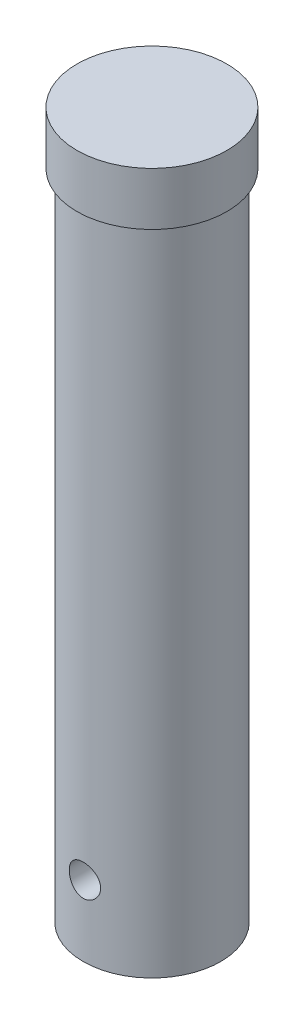
ISO-10303-21;
HEADER;
FILE_DESCRIPTION(('STEP AP214'),'2;1');
FILE_NAME('part.step','',(''),(''),'','','');
FILE_SCHEMA(('AUTOMOTIVE_DESIGN { 1 0 10303 214 1 1 1 1 }'));
ENDSEC;
DATA;
#1=APPLICATION_CONTEXT('core data for automotive mechanical design processes');
#2=APPLICATION_PROTOCOL_DEFINITION('international standard','automotive_design',2000,#1);
#3=PRODUCT_CONTEXT('',#1,'mechanical');
#4=PRODUCT('Part','Part','',(#3));
#5=PRODUCT_RELATED_PRODUCT_CATEGORY('part','',(#4));
#6=PRODUCT_DEFINITION_FORMATION('','',#4);
#7=PRODUCT_DEFINITION_CONTEXT('part definition',#1,'design');
#8=PRODUCT_DEFINITION('design','',#6,#7);
#9=PRODUCT_DEFINITION_SHAPE('','',#8);
#10=(LENGTH_UNIT() NAMED_UNIT(*) SI_UNIT(.MILLI.,.METRE.));
#11=(NAMED_UNIT(*) PLANE_ANGLE_UNIT() SI_UNIT($,.RADIAN.));
#12=(NAMED_UNIT(*) SI_UNIT($,.STERADIAN.) SOLID_ANGLE_UNIT());
#13=UNCERTAINTY_MEASURE_WITH_UNIT(LENGTH_MEASURE(1.E-05),#10,'distance_accuracy_value','');
#14=(GEOMETRIC_REPRESENTATION_CONTEXT(3) GLOBAL_UNCERTAINTY_ASSIGNED_CONTEXT((#13)) GLOBAL_UNIT_ASSIGNED_CONTEXT((#10,
#11,#12)) REPRESENTATION_CONTEXT('',''));
#15=CARTESIAN_POINT('',(0.,0.,0.));
#16=DIRECTION('',(0.,0.,1.));
#17=DIRECTION('',(1.,0.,0.));
#18=AXIS2_PLACEMENT_3D('',#15,#16,#17);
#19=CARTESIAN_POINT('',(0.,50.8,0.));
#20=DIRECTION('',(0.,-1.,0.));
#21=DIRECTION('',(0.,0.,-1.));
#22=AXIS2_PLACEMENT_3D('',#19,#20,#21);
#23=CYLINDRICAL_SURFACE('',#22,4.953);
#24=CARTESIAN_POINT('',(0.,6.2103,-4.953));
#25=CARTESIAN_POINT('',(-0.0626199285761378,6.21029796170064,-4.95299885982234));
#26=CARTESIAN_POINT('',(-0.125263915628987,6.2050786204916,-4.9518004601454));
#27=CARTESIAN_POINT('',(-0.248767848730751,6.18436359790857,-4.9471356569503));
#28=CARTESIAN_POINT('',(-0.309626567875278,6.16886101462116,-4.94366773019039));
#29=CARTESIAN_POINT('',(-0.427757638500117,6.12809403815568,-4.93484939195466));
#30=CARTESIAN_POINT('',(-0.485033822018721,6.10284029016601,-4.92950103388275));
#31=CARTESIAN_POINT('',(-0.594534999275647,6.04332272431043,-4.91749684162111));
#32=CARTESIAN_POINT('',(-0.646760034456201,6.00905898037578,-4.91084101815985));
#33=CARTESIAN_POINT('',(-0.745585278880662,5.93186432540785,-4.89681982569743));
#34=CARTESIAN_POINT('',(-0.792085167134784,5.88880668723982,-4.88944501694452));
#35=CARTESIAN_POINT('',(-0.877269669589451,5.79551834017492,-4.8748824269411));
#36=CARTESIAN_POINT('',(-0.91595353652863,5.74528694620422,-4.8676946636305));
#37=CARTESIAN_POINT('',(-0.984858948125117,5.63832443981465,-4.85422634930692));
#38=CARTESIAN_POINT('',(-1.01497212371892,5.58152186026023,-4.84795786373195));
#39=CARTESIAN_POINT('',(-1.06518571643235,5.4634954957409,-4.83717400761392));
#40=CARTESIAN_POINT('',(-1.08528744546674,5.40227229126573,-4.83265840738729));
#41=CARTESIAN_POINT('',(-1.11457286334543,5.27823530749103,-4.82598800971558));
#42=CARTESIAN_POINT('',(-1.12393499591184,5.21546577700867,-4.82379467555481));
#43=CARTESIAN_POINT('',(-1.13203060851418,5.08921162944782,-4.82190152579054));
#44=CARTESIAN_POINT('',(-1.13076551542939,5.02572710951142,-4.82220137543619));
#45=CARTESIAN_POINT('',(-1.11778583094973,4.90118332167816,-4.82522589604305));
#46=CARTESIAN_POINT('',(-1.1062800497989,4.84010093536548,-4.82790210978596));
#47=CARTESIAN_POINT('',(-1.07347707412558,4.72075697732271,-4.83530102830123));
#48=CARTESIAN_POINT('',(-1.05217928688351,4.6624955765856,-4.84002385695619));
#49=CARTESIAN_POINT('',(-1.00020918047969,4.54986829637329,-4.85103065569048));
#50=CARTESIAN_POINT('',(-0.969457888383556,4.49554018778821,-4.85732769031652));
#51=CARTESIAN_POINT('',(-0.89950912462752,4.39273866957521,-4.87076556092439));
#52=CARTESIAN_POINT('',(-0.860310405718226,4.34426612616341,-4.87790652144019));
#53=CARTESIAN_POINT('',(-0.773481017875347,4.25335105784433,-4.89243443641317));
#54=CARTESIAN_POINT('',(-0.725673166443643,4.21107786467138,-4.89982321881299));
#55=CARTESIAN_POINT('',(-0.623561481538659,4.1351199893696,-4.91386119966189));
#56=CARTESIAN_POINT('',(-0.569257509318103,4.10143549073038,-4.92051038230839));
#57=CARTESIAN_POINT('',(-0.455478312132164,4.04356354727669,-4.93234466054798));
#58=CARTESIAN_POINT('',(-0.395990615360193,4.01939982505162,-4.93752609008462));
#59=CARTESIAN_POINT('',(-0.273654210149566,3.98145956624479,-4.94581402396044));
#60=CARTESIAN_POINT('',(-0.210806036490164,3.96768138216777,-4.94892085739133));
#61=CARTESIAN_POINT('',(-0.0849837932500926,3.95115315622231,-4.95266215980127));
#62=CARTESIAN_POINT('',(-0.0220415789470728,3.94817202084962,-4.95334842858299));
#63=CARTESIAN_POINT('',(0.103441635756751,3.95269398780922,-4.95231712355682));
#64=CARTESIAN_POINT('',(0.16598266557124,3.96019631249098,-4.95059972804986));
#65=CARTESIAN_POINT('',(0.288111679367025,3.98528088715108,-4.94498690418659));
#66=CARTESIAN_POINT('',(0.34772617627607,4.00274051482367,-4.94111798560487));
#67=CARTESIAN_POINT('',(0.46317957867657,4.04710683269876,-4.9316358276821));
#68=CARTESIAN_POINT('',(0.519018143060428,4.07401437504444,-4.92602243100521));
#69=CARTESIAN_POINT('',(0.626279813765783,4.13698438088046,-4.91354714097944));
#70=CARTESIAN_POINT('',(0.677622174093214,4.17318077669369,-4.90666743888929));
#71=CARTESIAN_POINT('',(0.773586835466045,4.25352618089393,-4.89245642054869));
#72=CARTESIAN_POINT('',(0.818208179252645,4.29767632015136,-4.8851250401759));
#73=CARTESIAN_POINT('',(0.900389247090222,4.39374041390109,-4.87065579673175));
#74=CARTESIAN_POINT('',(0.93778828614353,4.44579306973901,-4.86352482498146));
#75=CARTESIAN_POINT('',(1.00331581556705,4.55557531219405,-4.85043167424552));
#76=CARTESIAN_POINT('',(1.03144471645571,4.61330464727829,-4.84446944350815));
#77=CARTESIAN_POINT('',(1.07743596432888,4.7324872812262,-4.83444879403588));
#78=CARTESIAN_POINT('',(1.09535763716511,4.79391671777432,-4.83037939975124));
#79=CARTESIAN_POINT('',(1.12059536621454,4.9190210411772,-4.82458762768936));
#80=CARTESIAN_POINT('',(1.12791329326675,4.98269552990199,-4.8228648358998));
#81=CARTESIAN_POINT('',(1.13165076857654,5.10885826245455,-4.82198904028732));
#82=CARTESIAN_POINT('',(1.12832562928786,5.17133865780576,-4.82277583339923));
#83=CARTESIAN_POINT('',(1.11144605960396,5.29482329548913,-4.82669351954363));
#84=CARTESIAN_POINT('',(1.09789177258402,5.35582755849892,-4.82982437972087));
#85=CARTESIAN_POINT('',(1.0610668667875,5.47440375345126,-4.83804682485853));
#86=CARTESIAN_POINT('',(1.03783652908223,5.53198879696175,-4.84313027450471));
#87=CARTESIAN_POINT('',(0.982352451474302,5.6424809379715,-4.8546876494469));
#88=CARTESIAN_POINT('',(0.950097677265903,5.69538749834671,-4.86116173410614));
#89=CARTESIAN_POINT('',(0.876647018520754,5.79627236988876,-4.8749483877141));
#90=CARTESIAN_POINT('',(0.83527054088432,5.84411713477704,-4.88227623304003));
#91=CARTESIAN_POINT('',(0.745113010308626,5.93226777957493,-4.8968456001938));
#92=CARTESIAN_POINT('',(0.696330238054623,5.97257190412012,-4.90408710155545));
#93=CARTESIAN_POINT('',(0.591897791767745,6.04505608162774,-4.91779179304421));
#94=CARTESIAN_POINT('',(0.53615936041198,6.07711080828872,-4.92424227578294));
#95=CARTESIAN_POINT('',(0.419947874369055,6.1313450307413,-4.9355089876801));
#96=CARTESIAN_POINT('',(0.359478672504198,6.1535324661758,-4.94032653002682));
#97=CARTESIAN_POINT('',(0.249161833379965,6.18363661903301,-4.94696701823175));
#98=CARTESIAN_POINT('',(0.199892110306613,6.19361560135405,-4.94921494205356));
#99=CARTESIAN_POINT('',(0.100420049770205,6.20694793636163,-4.95223185155115));
#100=CARTESIAN_POINT('',(0.0502177610850681,6.21030163460471,-4.95300091436018));
#101=CARTESIAN_POINT('',(0.,6.2103,-4.953));
#102=B_SPLINE_CURVE_WITH_KNOTS('',3,(#24,#25,#26,#27,#28,#29,#30,#31,#32,#33,#34,#35,#36,#37,
#38,#39,#40,#41,#42,#43,#44,#45,#46,#47,#48,#49,#50,#51,#52,#53,#54,#55,#56,#57,#58,#59,#60,#61,
#62,#63,#64,#65,#66,#67,#68,#69,#70,#71,#72,#73,#74,#75,#76,#77,#78,#79,#80,#81,#82,#83,#84,#85,
#86,#87,#88,#89,#90,#91,#92,#93,#94,#95,#96,#97,#98,#99,#100,#101),.UNSPECIFIED.,.T.,.F.,(4,2,2,
2,2,2,2,2,2,2,2,2,2,2,2,2,2,2,2,2,2,2,2,2,2,2,2,2,2,2,2,2,2,2,2,2,2,2,4),(0.,0.187675908758004,
0.375477909588762,0.563075467036626,0.750671485206516,0.941190489509334,1.13172770003112,
1.32457672015871,1.51740046241216,1.70697169608312,1.89651747711464,2.08228472181698,
2.26806321267075,2.45543789605261,2.64284026399212,2.83466591425551,3.0264956623553,
3.21880040827998,3.41107464178753,3.59920839376264,3.7873281909417,3.97317986395116,
4.15904830393398,4.34776411891302,4.53650678688366,4.72905850027917,4.9216016855757,
5.11301405299601,5.30439264505538,5.49121504425226,5.67803482493057,5.86408453347513,
6.05015557422851,6.24030781236688,6.43050426058246,6.62343917317397,6.81621855998237,
6.96673223454017,7.11723805851238),.UNSPECIFIED.);
#103=CARTESIAN_POINT('',(0.,6.2103,-4.953));
#104=VERTEX_POINT('',#103);
#105=EDGE_CURVE('E45',#104,#104,#102,.T.);
#106=ORIENTED_EDGE('',*,*,#105,.T.);
#107=EDGE_LOOP('',(#106));
#108=FACE_BOUND('',#107,.T.);
#109=CARTESIAN_POINT('',(1.1303,5.08,4.82230555958454));
#110=CARTESIAN_POINT('',(1.13029794533734,5.01740400765558,4.82230681935707));
#111=CARTESIAN_POINT('',(1.1250824576697,4.95478391797633,4.82353763835972));
#112=CARTESIAN_POINT('',(1.10438412687968,4.83132958248992,4.82831787141745));
#113=CARTESIAN_POINT('',(1.08889428394032,4.77049658373733,4.83186886616074));
#114=CARTESIAN_POINT('',(1.04816454552683,4.65242002528655,4.84086681548338));
#115=CARTESIAN_POINT('',(1.02293589142768,4.59517241524901,4.846311583392));
#116=CARTESIAN_POINT('',(0.963477503632184,4.48571953458871,4.85848093497291));
#117=CARTESIAN_POINT('',(0.929247787958489,4.43351425387006,4.86520551608265));
#118=CARTESIAN_POINT('',(0.8520882462994,4.33466846706929,4.87931490365225));
#119=CARTESIAN_POINT('',(0.809024039707081,4.28813413499004,4.88670878162016));
#120=CARTESIAN_POINT('',(0.715707870789584,4.20288265323667,4.90124445701719));
#121=CARTESIAN_POINT('',(0.665455319044242,4.16416614522632,4.90838623371491));
#122=CARTESIAN_POINT('',(0.558472533323851,4.09522514191633,4.9217122849259));
#123=CARTESIAN_POINT('',(0.501674462679876,4.06510340602211,4.92788460593556));
#124=CARTESIAN_POINT('',(0.383657809061746,4.01487276504197,4.93847352514551));
#125=CARTESIAN_POINT('',(0.322439767988981,3.99476263488254,4.94289033814579));
#126=CARTESIAN_POINT('',(0.198425819925628,3.96546178691146,4.94940647409186));
#127=CARTESIAN_POINT('',(0.135674451612387,3.95609118674966,4.95154393149663));
#128=CARTESIAN_POINT('',(0.00945640153920111,3.94797233459766,4.95339286971582));
#129=CARTESIAN_POINT('',(-0.0540101904738555,3.94922276437208,4.95310465159442));
#130=CARTESIAN_POINT('',(-0.178614878217033,3.96217783395304,4.95016363859237));
#131=CARTESIAN_POINT('',(-0.239774329421876,3.97368850754078,4.94755471764636));
#132=CARTESIAN_POINT('',(-0.359269824195748,4.00652745222047,4.94031573572673));
#133=CARTESIAN_POINT('',(-0.417605732798204,4.02785619210912,4.9356855782429));
#134=CARTESIAN_POINT('',(-0.530328666445901,4.07989309771645,4.92485480358431));
#135=CARTESIAN_POINT('',(-0.584681154131916,4.11067347312808,4.91864216092298));
#136=CARTESIAN_POINT('',(-0.687519395181748,4.18068581162318,4.90532555911359));
#137=CARTESIAN_POINT('',(-0.736004282187348,4.21991902040565,4.89822146865684));
#138=CARTESIAN_POINT('',(-0.826885724606379,4.30677478086676,4.88371147151797));
#139=CARTESIAN_POINT('',(-0.869119722730676,4.3545670501932,4.87630237273693));
#140=CARTESIAN_POINT('',(-0.945005685855244,4.45663297874947,4.86216696303822));
#141=CARTESIAN_POINT('',(-0.978657374560047,4.51090684656273,4.85544067410684));
#142=CARTESIAN_POINT('',(-1.03650471754877,4.62467422309373,4.84342306256569));
#143=CARTESIAN_POINT('',(-1.06066723919778,4.68418514796902,4.8381367872821));
#144=CARTESIAN_POINT('',(-1.09859816720351,4.80657254516951,4.8296659059022));
#145=CARTESIAN_POINT('',(-1.1123683852708,4.86944842882718,4.82648093349385));
#146=CARTESIAN_POINT('',(-1.12886664121584,4.99528911567059,4.82264864179028));
#147=CARTESIAN_POINT('',(-1.13183243218251,5.05822112168803,4.82194669337867));
#148=CARTESIAN_POINT('',(-1.12728343507696,5.18368039466325,4.82301217195449));
#149=CARTESIAN_POINT('',(-1.11976943635109,5.24620769174767,4.82477941296058));
#150=CARTESIAN_POINT('',(-1.09468109872252,5.36823904156243,4.83053233442099));
#151=CARTESIAN_POINT('',(-1.0772398522645,5.42777197017364,4.83448864727994));
#152=CARTESIAN_POINT('',(-1.03293720896622,5.54307026507625,4.84414704038036));
#153=CARTESIAN_POINT('',(-1.00607484585817,5.59883524421157,4.84984929968554));
#154=CARTESIAN_POINT('',(-0.94317633698041,5.70603734374381,4.86247565262038));
#155=CARTESIAN_POINT('',(-0.906994979091743,5.7573870091098,4.86941849846307));
#156=CARTESIAN_POINT('',(-0.826673664527466,5.85337327239827,4.88369531376433));
#157=CARTESIAN_POINT('',(-0.782532627469786,5.89800895750935,4.89102933622274));
#158=CARTESIAN_POINT('',(-0.686464589324353,5.98023466320235,4.90544370034424));
#159=CARTESIAN_POINT('',(-0.634396794567038,6.01766188780059,4.91251578429577));
#160=CARTESIAN_POINT('',(-0.524575427473208,6.08323886922287,4.92545247088723));
#161=CARTESIAN_POINT('',(-0.466822132412568,6.11138907818643,4.93131713236881));
#162=CARTESIAN_POINT('',(-0.347643774415581,6.15739204896375,4.94114362952821));
#163=CARTESIAN_POINT('',(-0.286246163688781,6.17531311701939,4.94511805697853));
#164=CARTESIAN_POINT('',(-0.161210060769601,6.20056036485066,4.95077093435552));
#165=CARTESIAN_POINT('',(-0.097571926511641,6.20788822914496,4.95244974932546));
#166=CARTESIAN_POINT('',(0.0285981706490339,6.2116597402524,4.95331022293915));
#167=CARTESIAN_POINT('',(0.0911226353898429,6.20834559076199,4.9525474513921));
#168=CARTESIAN_POINT('',(0.214698390469133,6.19147267422064,4.94873072368518));
#169=CARTESIAN_POINT('',(0.275749711956738,6.17791412398039,4.94567681601451));
#170=CARTESIAN_POINT('',(0.39443946321055,6.14105759391802,4.93762640177551));
#171=CARTESIAN_POINT('',(0.452089956978315,6.1177967416062,4.93263730558124));
#172=CARTESIAN_POINT('',(0.562700627830038,6.06223108721612,4.92124700826988));
#173=CARTESIAN_POINT('',(0.615660306581101,6.02992532575725,4.91484565737223));
#174=CARTESIAN_POINT('',(0.716558223887819,5.95641192268231,4.90116325573141));
#175=CARTESIAN_POINT('',(0.76437152096784,5.91503563708166,4.89386688314999));
#176=CARTESIAN_POINT('',(0.852458781701526,5.82489225135192,4.87929513201851));
#177=CARTESIAN_POINT('',(0.892730902368631,5.77612334979865,4.87201975902715));
#178=CARTESIAN_POINT('',(0.965172109467478,5.67170802167603,4.85819261305376));
#179=CARTESIAN_POINT('',(0.997212046089,5.61597025420855,4.85165318373552));
#180=CARTESIAN_POINT('',(1.05141878998677,5.499761960663,4.84019636697926));
#181=CARTESIAN_POINT('',(1.07359362134694,5.43929532819915,4.83527766212335));
#182=CARTESIAN_POINT('',(1.10366933061005,5.3290100096604,4.82848860407021));
#183=CARTESIAN_POINT('',(1.11363595178907,5.27977090360508,4.82618592639864));
#184=CARTESIAN_POINT('',(1.12695191869292,5.18035965912465,4.82309394292221));
#185=CARTESIAN_POINT('',(1.13030164736642,5.13018757486475,4.82230454953701));
#186=CARTESIAN_POINT('',(1.1303,5.08,4.82230555958454));
#187=B_SPLINE_CURVE_WITH_KNOTS('',3,(#109,#110,#111,#112,#113,#114,#115,#116,#117,#118,#119,
#120,#121,#122,#123,#124,#125,#126,#127,#128,#129,#130,#131,#132,#133,#134,#135,#136,#137,#138,
#139,#140,#141,#142,#143,#144,#145,#146,#147,#148,#149,#150,#151,#152,#153,#154,#155,#156,#157,
#158,#159,#160,#161,#162,#163,#164,#165,#166,#167,#168,#169,#170,#171,#172,#173,#174,#175,#176,
#177,#178,#179,#180,#181,#182,#183,#184,#185,#186),.UNSPECIFIED.,.T.,.F.,(4,2,2,2,2,2,2,2,2,2,2,
2,2,2,2,2,2,2,2,2,2,2,2,2,2,2,2,2,2,2,2,2,2,2,2,2,2,2,4),(0.,0.187603941607324,
0.375335827391729,0.562851661716722,0.750367120585176,0.940980246391862,1.13160901080363,
1.32442961999191,1.5172266288183,1.70674487982663,1.89623960900933,2.08222624271296,
2.26822175789691,2.45567518958626,2.64315626531618,2.83487887011937,3.02660764638517,
3.21900003952577,3.41135888477217,3.59945836863033,3.7875436854463,3.97316485519852,
4.15880506857831,4.34753429664483,4.53628916058914,4.72890502722228,4.92151150483119,
5.11281631426555,5.30409069928905,5.49104295091468,5.67799124602691,5.86423062121226,
6.05048975803142,6.24056061889133,6.43067787067812,6.62361711328632,6.81639913466968,
6.96682301116763,7.11723818171935),.UNSPECIFIED.);
#188=CARTESIAN_POINT('',(1.1303,5.08,4.82230555958454));
#189=VERTEX_POINT('',#188);
#190=EDGE_CURVE('E10',#189,#189,#187,.T.);
#191=ORIENTED_EDGE('',*,*,#190,.T.);
#192=EDGE_LOOP('',(#191));
#193=FACE_BOUND('',#192,.T.);
#194=CARTESIAN_POINT('',(0.,0.,0.));
#195=DIRECTION('',(0.,1.,0.));
#196=DIRECTION('',(0.,0.,1.));
#197=AXIS2_PLACEMENT_3D('',#194,#195,#196);
#198=CIRCLE('',#197,4.953);
#199=CARTESIAN_POINT('',(0.,0.,4.953));
#200=VERTEX_POINT('',#199);
#201=EDGE_CURVE('E59',#200,#200,#198,.T.);
#202=ORIENTED_EDGE('',*,*,#201,.T.);
#203=EDGE_LOOP('',(#202));
#204=FACE_BOUND('',#203,.T.);
#205=CARTESIAN_POINT('',(0.,46.99,0.));
#206=DIRECTION('',(0.,1.,0.));
#207=DIRECTION('',(0.,0.,1.));
#208=AXIS2_PLACEMENT_3D('',#205,#206,#207);
#209=CIRCLE('',#208,4.953);
#210=CARTESIAN_POINT('',(0.,46.99,4.953));
#211=VERTEX_POINT('',#210);
#212=EDGE_CURVE('E54',#211,#211,#209,.T.);
#213=ORIENTED_EDGE('',*,*,#212,.F.);
#214=EDGE_LOOP('',(#213));
#215=FACE_BOUND('',#214,.T.);
#216=ADVANCED_FACE('F41',(#108,#193,#204,#215),#23,.T.);
#217=CARTESIAN_POINT('',(0.,0.,0.));
#218=DIRECTION('',(0.,1.,0.));
#219=DIRECTION('',(0.,0.,1.));
#220=AXIS2_PLACEMENT_3D('',#217,#218,#219);
#221=PLANE('',#220);
#222=ORIENTED_EDGE('',*,*,#201,.F.);
#223=EDGE_LOOP('',(#222));
#224=FACE_BOUND('',#223,.T.);
#225=ADVANCED_FACE('F79',(#224),#221,.F.);
#226=CARTESIAN_POINT('',(0.,46.99,0.));
#227=DIRECTION('',(0.,1.,0.));
#228=DIRECTION('',(0.,0.,1.));
#229=AXIS2_PLACEMENT_3D('',#226,#227,#228);
#230=CYLINDRICAL_SURFACE('',#229,5.3975);
#231=CARTESIAN_POINT('',(0.,46.99,0.));
#232=DIRECTION('',(0.,1.,0.));
#233=DIRECTION('',(0.,0.,1.));
#234=AXIS2_PLACEMENT_3D('',#231,#232,#233);
#235=CIRCLE('',#234,5.3975);
#236=CARTESIAN_POINT('',(0.,46.99,5.3975));
#237=VERTEX_POINT('',#236);
#238=EDGE_CURVE('E93',#237,#237,#235,.T.);
#239=CARTESIAN_POINT('',(0.,50.8,0.));
#240=DIRECTION('',(0.,1.,0.));
#241=DIRECTION('',(0.,0.,1.));
#242=AXIS2_PLACEMENT_3D('',#239,#240,#241);
#243=CIRCLE('',#242,5.3975);
#244=CARTESIAN_POINT('',(0.,50.8,5.3975));
#245=VERTEX_POINT('',#244);
#246=EDGE_CURVE('E96',#245,#245,#243,.T.);
#247=CARTESIAN_POINT('',(0.,46.99,5.3975));
#248=CARTESIAN_POINT('',(0.,47.0296875,5.3975));
#249=CARTESIAN_POINT('',(0.,47.069375,5.3975));
#250=CARTESIAN_POINT('',(0.,47.14875,5.3975));
#251=CARTESIAN_POINT('',(0.,47.1884375,5.3975));
#252=CARTESIAN_POINT('',(0.,47.2678125,5.3975));
#253=CARTESIAN_POINT('',(0.,47.3075,5.3975));
#254=CARTESIAN_POINT('',(0.,47.386875,5.3975));
#255=CARTESIAN_POINT('',(0.,47.4265625,5.3975));
#256=CARTESIAN_POINT('',(0.,47.5059375,5.3975));
#257=CARTESIAN_POINT('',(0.,47.545625,5.3975));
#258=CARTESIAN_POINT('',(0.,47.625,5.3975));
#259=CARTESIAN_POINT('',(0.,47.6646875,5.3975));
#260=CARTESIAN_POINT('',(0.,47.7440625,5.3975));
#261=CARTESIAN_POINT('',(0.,47.78375,5.3975));
#262=CARTESIAN_POINT('',(0.,47.863125,5.3975));
#263=CARTESIAN_POINT('',(0.,47.9028125,5.3975));
#264=CARTESIAN_POINT('',(0.,47.9821875,5.3975));
#265=CARTESIAN_POINT('',(0.,48.021875,5.3975));
#266=CARTESIAN_POINT('',(0.,48.10125,5.3975));
#267=CARTESIAN_POINT('',(0.,48.1409375,5.3975));
#268=CARTESIAN_POINT('',(0.,48.2203125,5.3975));
#269=CARTESIAN_POINT('',(0.,48.26,5.3975));
#270=CARTESIAN_POINT('',(0.,48.339375,5.3975));
#271=CARTESIAN_POINT('',(0.,48.3790625,5.3975));
#272=CARTESIAN_POINT('',(0.,48.4584375,5.3975));
#273=CARTESIAN_POINT('',(0.,48.498125,5.3975));
#274=CARTESIAN_POINT('',(0.,48.5775,5.3975));
#275=CARTESIAN_POINT('',(0.,48.6171875,5.3975));
#276=CARTESIAN_POINT('',(0.,48.6965625,5.3975));
#277=CARTESIAN_POINT('',(0.,48.73625,5.3975));
#278=CARTESIAN_POINT('',(0.,48.815625,5.3975));
#279=CARTESIAN_POINT('',(0.,48.8553125,5.3975));
#280=CARTESIAN_POINT('',(0.,48.9346875,5.3975));
#281=CARTESIAN_POINT('',(0.,48.974375,5.3975));
#282=CARTESIAN_POINT('',(0.,49.05375,5.3975));
#283=CARTESIAN_POINT('',(0.,49.0934375,5.3975));
#284=CARTESIAN_POINT('',(0.,49.1728125,5.3975));
#285=CARTESIAN_POINT('',(0.,49.2125,5.3975));
#286=CARTESIAN_POINT('',(0.,49.291875,5.3975));
#287=CARTESIAN_POINT('',(0.,49.3315625,5.3975));
#288=CARTESIAN_POINT('',(0.,49.4109375,5.3975));
#289=CARTESIAN_POINT('',(0.,49.450625,5.3975));
#290=CARTESIAN_POINT('',(0.,49.53,5.3975));
#291=CARTESIAN_POINT('',(0.,49.5696875,5.3975));
#292=CARTESIAN_POINT('',(0.,49.6490625,5.3975));
#293=CARTESIAN_POINT('',(0.,49.68875,5.3975));
#294=CARTESIAN_POINT('',(0.,49.768125,5.3975));
#295=CARTESIAN_POINT('',(0.,49.8078125,5.3975));
#296=CARTESIAN_POINT('',(0.,49.8871875,5.3975));
#297=CARTESIAN_POINT('',(0.,49.926875,5.3975));
#298=CARTESIAN_POINT('',(0.,50.00625,5.3975));
#299=CARTESIAN_POINT('',(0.,50.0459375,5.3975));
#300=CARTESIAN_POINT('',(0.,50.1253125,5.3975));
#301=CARTESIAN_POINT('',(0.,50.165,5.3975));
#302=CARTESIAN_POINT('',(0.,50.244375,5.3975));
#303=CARTESIAN_POINT('',(0.,50.2840625,5.3975));
#304=CARTESIAN_POINT('',(0.,50.3634375,5.3975));
#305=CARTESIAN_POINT('',(0.,50.403125,5.3975));
#306=CARTESIAN_POINT('',(0.,50.4825,5.3975));
#307=CARTESIAN_POINT('',(0.,50.5221875,5.3975));
#308=CARTESIAN_POINT('',(0.,50.6015625,5.3975));
#309=CARTESIAN_POINT('',(0.,50.64125,5.3975));
#310=CARTESIAN_POINT('',(0.,50.720625,5.3975));
#311=CARTESIAN_POINT('',(0.,50.7603125,5.3975));
#312=CARTESIAN_POINT('',(0.,50.8,5.3975));
#313=B_SPLINE_CURVE_WITH_KNOTS('',3,(#247,#248,#249,#250,#251,#252,#253,#254,#255,#256,#257,
#258,#259,#260,#261,#262,#263,#264,#265,#266,#267,#268,#269,#270,#271,#272,#273,#274,#275,#276,
#277,#278,#279,#280,#281,#282,#283,#284,#285,#286,#287,#288,#289,#290,#291,#292,#293,#294,#295,
#296,#297,#298,#299,#300,#301,#302,#303,#304,#305,#306,#307,#308,#309,#310,#311,#312),
.UNSPECIFIED.,.F.,.F.,(4,2,2,2,2,2,2,2,2,2,2,2,2,2,2,2,2,2,2,2,2,2,2,2,2,2,2,2,2,2,2,2,4),(0.,
0.119062500000003,0.238125000000006,0.357187500000002,0.476250000000004,0.5953125,
0.714375000000003,0.833437500000006,0.952500000000002,1.0715625,1.190625,1.3096875,
1.42875000000001,1.5478125,1.66687500000001,1.7859375,1.905,2.02406250000001,2.143125,
2.26218750000001,2.38125,2.5003125,2.61937500000001,2.7384375,2.85750000000001,2.9765625,
3.095625,3.2146875,3.33375,3.45281250000001,3.571875,3.6909375,3.81),.UNSPECIFIED.);
#314=EDGE_CURVE('BSEAM75',#237,#245,#313,.T.);
#315=ORIENTED_EDGE('',*,*,#238,.T.);
#316=ORIENTED_EDGE('',*,*,#246,.F.);
#317=ORIENTED_EDGE('',*,*,#314,.T.);
#318=ORIENTED_EDGE('',*,*,#314,.F.);
#319=EDGE_LOOP('',(#315,#317,#316,#318));
#320=FACE_BOUND('',#319,.T.);
#321=ADVANCED_FACE('F75',(#320),#230,.T.);
#322=CARTESIAN_POINT('',(0.,46.99,0.));
#323=DIRECTION('',(0.,1.,0.));
#324=DIRECTION('',(0.,0.,1.));
#325=AXIS2_PLACEMENT_3D('',#322,#323,#324);
#326=PLANE('',#325);
#327=ORIENTED_EDGE('',*,*,#212,.T.);
#328=EDGE_LOOP('',(#327));
#329=FACE_BOUND('',#328,.T.);
#330=ORIENTED_EDGE('',*,*,#238,.F.);
#331=EDGE_LOOP('',(#330));
#332=FACE_BOUND('',#331,.T.);
#333=ADVANCED_FACE('F71',(#329,#332),#326,.F.);
#334=CARTESIAN_POINT('',(0.,50.8,0.));
#335=DIRECTION('',(0.,1.,0.));
#336=DIRECTION('',(0.,0.,1.));
#337=AXIS2_PLACEMENT_3D('',#334,#335,#336);
#338=PLANE('',#337);
#339=ORIENTED_EDGE('',*,*,#246,.T.);
#340=EDGE_LOOP('',(#339));
#341=FACE_BOUND('',#340,.T.);
#342=ADVANCED_FACE('F69',(#341),#338,.T.);
#343=CARTESIAN_POINT('',(0.,5.08,4.953));
#344=DIRECTION('',(0.,0.,1.));
#345=DIRECTION('',(1.,0.,0.));
#346=AXIS2_PLACEMENT_3D('',#343,#344,#345);
#347=CYLINDRICAL_SURFACE('',#346,1.1303);
#348=ORIENTED_EDGE('',*,*,#190,.F.);
#349=EDGE_LOOP('',(#348));
#350=FACE_BOUND('',#349,.T.);
#351=ORIENTED_EDGE('',*,*,#105,.F.);
#352=EDGE_LOOP('',(#351));
#353=FACE_BOUND('',#352,.T.);
#354=ADVANCED_FACE('F65',(#350,#353),#347,.F.);
#355=CLOSED_SHELL('',(#216,#225,#321,#333,#342,#354));
#356=MANIFOLD_SOLID_BREP('B2',#355);
#357=ADVANCED_BREP_SHAPE_REPRESENTATION('',(#18,#356),#14);
#358=SHAPE_DEFINITION_REPRESENTATION(#9,#357);
ENDSEC;
END-ISO-10303-21;
